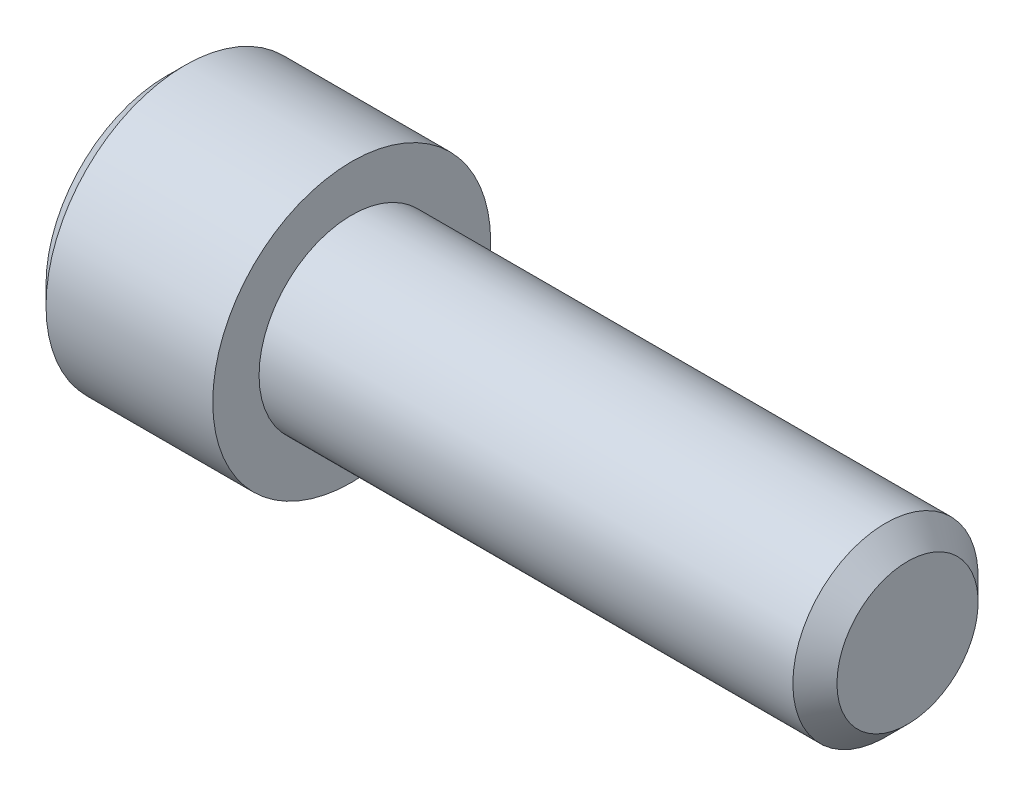
ISO-10303-21;
HEADER;
FILE_DESCRIPTION(('STEP AP214'),'2;1');
FILE_NAME('part.step','',(''),(''),'','','');
FILE_SCHEMA(('AUTOMOTIVE_DESIGN { 1 0 10303 214 1 1 1 1 }'));
ENDSEC;
DATA;
#1=APPLICATION_CONTEXT('core data for automotive mechanical design processes');
#2=APPLICATION_PROTOCOL_DEFINITION('international standard','automotive_design',2000,#1);
#3=PRODUCT_CONTEXT('',#1,'mechanical');
#4=PRODUCT('Part','Part','',(#3));
#5=PRODUCT_RELATED_PRODUCT_CATEGORY('part','',(#4));
#6=PRODUCT_DEFINITION_FORMATION('','',#4);
#7=PRODUCT_DEFINITION_CONTEXT('part definition',#1,'design');
#8=PRODUCT_DEFINITION('design','',#6,#7);
#9=PRODUCT_DEFINITION_SHAPE('','',#8);
#10=(LENGTH_UNIT() NAMED_UNIT(*) SI_UNIT(.MILLI.,.METRE.));
#11=(NAMED_UNIT(*) PLANE_ANGLE_UNIT() SI_UNIT($,.RADIAN.));
#12=(NAMED_UNIT(*) SI_UNIT($,.STERADIAN.) SOLID_ANGLE_UNIT());
#13=UNCERTAINTY_MEASURE_WITH_UNIT(LENGTH_MEASURE(1.E-05),#10,'distance_accuracy_value','');
#14=(GEOMETRIC_REPRESENTATION_CONTEXT(3) GLOBAL_UNCERTAINTY_ASSIGNED_CONTEXT((#13)) GLOBAL_UNIT_ASSIGNED_CONTEXT((#10,
#11,#12)) REPRESENTATION_CONTEXT('',''));
#15=CARTESIAN_POINT('',(0.,0.,0.));
#16=DIRECTION('',(0.,0.,1.));
#17=DIRECTION('',(1.,0.,0.));
#18=AXIS2_PLACEMENT_3D('',#15,#16,#17);
#19=CARTESIAN_POINT('',(0.,0.,0.));
#20=DIRECTION('',(-1.,0.,0.));
#21=DIRECTION('',(0.,0.,1.));
#22=AXIS2_PLACEMENT_3D('',#19,#20,#21);
#23=PLANE('',#22);
#24=CARTESIAN_POINT('',(0.,0.,0.));
#25=DIRECTION('',(-1.,0.,0.));
#26=DIRECTION('',(0.,0.,1.));
#27=AXIS2_PLACEMENT_3D('',#24,#25,#26);
#28=CIRCLE('',#27,4.1275);
#29=CARTESIAN_POINT('',(0.,0.,4.1275));
#30=VERTEX_POINT('',#29);
#31=EDGE_CURVE('E134',#30,#30,#28,.T.);
#32=ORIENTED_EDGE('',*,*,#31,.T.);
#33=EDGE_LOOP('',(#32));
#34=FACE_BOUND('',#33,.T.);
#35=DIRECTION('',(0.,-0.500000000000001,-0.866025403784438));
#36=VECTOR('',#35,1.);
#37=CARTESIAN_POINT('',(0.,2.7496306570156,0.));
#38=LINE('',#37,#36);
#39=CARTESIAN_POINT('',(0.,2.7496306570156,0.));
#40=VERTEX_POINT('',#39);
#41=CARTESIAN_POINT('',(0.,1.3748153285078,-2.38125));
#42=VERTEX_POINT('',#41);
#43=EDGE_CURVE('E125',#40,#42,#38,.T.);
#44=ORIENTED_EDGE('',*,*,#43,.F.);
#45=DIRECTION('',(0.,-0.499999999999998,0.86602540378444));
#46=VECTOR('',#45,1.);
#47=CARTESIAN_POINT('',(0.,2.7496306570156,0.));
#48=LINE('',#47,#46);
#49=CARTESIAN_POINT('',(0.,1.37481532850781,2.38125));
#50=VERTEX_POINT('',#49);
#51=EDGE_CURVE('E47',#40,#50,#48,.T.);
#52=ORIENTED_EDGE('',*,*,#51,.T.);
#53=DIRECTION('',(0.,1.,0.));
#54=VECTOR('',#53,1.);
#55=CARTESIAN_POINT('',(0.,-1.37481532850779,2.38125));
#56=LINE('',#55,#54);
#57=CARTESIAN_POINT('',(0.,-1.37481532850779,2.38125));
#58=VERTEX_POINT('',#57);
#59=EDGE_CURVE('E116',#58,#50,#56,.T.);
#60=ORIENTED_EDGE('',*,*,#59,.F.);
#61=DIRECTION('',(0.,-0.500000000000001,-0.866025403784438));
#62=VECTOR('',#61,1.);
#63=CARTESIAN_POINT('',(0.,-1.37481532850779,2.38125));
#64=LINE('',#63,#62);
#65=CARTESIAN_POINT('',(0.,-2.74963065701559,0.));
#66=VERTEX_POINT('',#65);
#67=EDGE_CURVE('E119',#58,#66,#64,.T.);
#68=ORIENTED_EDGE('',*,*,#67,.T.);
#69=DIRECTION('',(0.,0.499999999999998,-0.86602540378444));
#70=VECTOR('',#69,1.);
#71=CARTESIAN_POINT('',(0.,-2.74963065701559,0.));
#72=LINE('',#71,#70);
#73=CARTESIAN_POINT('',(0.,-1.3748153285078,-2.38125));
#74=VERTEX_POINT('',#73);
#75=EDGE_CURVE('E122',#66,#74,#72,.T.);
#76=ORIENTED_EDGE('',*,*,#75,.T.);
#77=DIRECTION('',(0.,-1.,0.));
#78=VECTOR('',#77,1.);
#79=CARTESIAN_POINT('',(0.,1.3748153285078,-2.38125));
#80=LINE('',#79,#78);
#81=EDGE_CURVE('E105',#42,#74,#80,.T.);
#82=ORIENTED_EDGE('',*,*,#81,.F.);
#83=EDGE_LOOP('',(#44,#52,#60,#68,#76,#82));
#84=FACE_BOUND('',#83,.T.);
#85=ADVANCED_FACE('F32',(#34,#84),#23,.T.);
#86=CARTESIAN_POINT('',(25.4,2.41935,0.));
#87=DIRECTION('',(1.,0.,0.));
#88=DIRECTION('',(0.,0.,-1.));
#89=AXIS2_PLACEMENT_3D('',#86,#87,#88);
#90=PLANE('',#89);
#91=CARTESIAN_POINT('',(25.4,0.,0.));
#92=DIRECTION('',(-1.,0.,0.));
#93=DIRECTION('',(0.,0.,1.));
#94=AXIS2_PLACEMENT_3D('',#91,#92,#93);
#95=CIRCLE('',#94,2.41935);
#96=CARTESIAN_POINT('',(25.4,0.,2.41935));
#97=VERTEX_POINT('',#96);
#98=EDGE_CURVE('E11',#97,#97,#95,.T.);
#99=ORIENTED_EDGE('',*,*,#98,.F.);
#100=EDGE_LOOP('',(#99));
#101=FACE_BOUND('',#100,.T.);
#102=ADVANCED_FACE('F34',(#101),#90,.T.);
#103=CARTESIAN_POINT('',(25.4,0.,0.));
#104=DIRECTION('',(-1.,0.,0.));
#105=DIRECTION('',(0.,0.,1.));
#106=AXIS2_PLACEMENT_3D('',#103,#104,#105);
#107=CONICAL_SURFACE('',#106,2.41935,0.785398163397369);
#108=CARTESIAN_POINT('',(24.64435,0.,0.));
#109=DIRECTION('',(-1.,0.,0.));
#110=DIRECTION('',(0.,0.,1.));
#111=AXIS2_PLACEMENT_3D('',#108,#109,#110);
#112=CIRCLE('',#111,3.17499999999993);
#113=CARTESIAN_POINT('',(24.64435,0.,3.17499999999993));
#114=VERTEX_POINT('',#113);
#115=EDGE_CURVE('E40',#114,#114,#112,.T.);
#116=ORIENTED_EDGE('',*,*,#115,.F.);
#117=EDGE_LOOP('',(#116));
#118=FACE_BOUND('',#117,.T.);
#119=ORIENTED_EDGE('',*,*,#98,.T.);
#120=EDGE_LOOP('',(#119));
#121=FACE_BOUND('',#120,.T.);
#122=ADVANCED_FACE('F151',(#118,#121),#107,.T.);
#123=CARTESIAN_POINT('',(-31.75,0.,0.));
#124=DIRECTION('',(-1.,0.,0.));
#125=DIRECTION('',(0.,0.,1.));
#126=AXIS2_PLACEMENT_3D('',#123,#124,#125);
#127=CYLINDRICAL_SURFACE('',#126,3.17499999999996);
#128=ORIENTED_EDGE('',*,*,#115,.T.);
#129=EDGE_LOOP('',(#128));
#130=FACE_BOUND('',#129,.T.);
#131=CARTESIAN_POINT('',(6.35,0.,0.));
#132=DIRECTION('',(-1.,0.,0.));
#133=DIRECTION('',(0.,0.,1.));
#134=AXIS2_PLACEMENT_3D('',#131,#132,#133);
#135=CIRCLE('',#134,3.175);
#136=CARTESIAN_POINT('',(6.35,0.,3.175));
#137=VERTEX_POINT('',#136);
#138=EDGE_CURVE('E143',#137,#137,#135,.T.);
#139=ORIENTED_EDGE('',*,*,#138,.F.);
#140=EDGE_LOOP('',(#139));
#141=FACE_BOUND('',#140,.T.);
#142=ADVANCED_FACE('F148',(#130,#141),#127,.T.);
#143=CARTESIAN_POINT('',(6.35,4.7625,0.));
#144=DIRECTION('',(1.,0.,0.));
#145=DIRECTION('',(0.,0.,-1.));
#146=AXIS2_PLACEMENT_3D('',#143,#144,#145);
#147=PLANE('',#146);
#148=ORIENTED_EDGE('',*,*,#138,.T.);
#149=EDGE_LOOP('',(#148));
#150=FACE_BOUND('',#149,.T.);
#151=CARTESIAN_POINT('',(6.35,0.,0.));
#152=DIRECTION('',(-1.,0.,0.));
#153=DIRECTION('',(0.,0.,1.));
#154=AXIS2_PLACEMENT_3D('',#151,#152,#153);
#155=CIRCLE('',#154,4.7625);
#156=CARTESIAN_POINT('',(6.35,0.,4.7625));
#157=VERTEX_POINT('',#156);
#158=EDGE_CURVE('E140',#157,#157,#155,.T.);
#159=ORIENTED_EDGE('',*,*,#158,.F.);
#160=EDGE_LOOP('',(#159));
#161=FACE_BOUND('',#160,.T.);
#162=ADVANCED_FACE('F176',(#150,#161),#147,.T.);
#163=CARTESIAN_POINT('',(-31.75,0.,0.));
#164=DIRECTION('',(-1.,0.,0.));
#165=DIRECTION('',(0.,0.,1.));
#166=AXIS2_PLACEMENT_3D('',#163,#164,#165);
#167=CYLINDRICAL_SURFACE('',#166,4.7625);
#168=ORIENTED_EDGE('',*,*,#158,.T.);
#169=EDGE_LOOP('',(#168));
#170=FACE_BOUND('',#169,.T.);
#171=CARTESIAN_POINT('',(0.634999999999997,0.,0.));
#172=DIRECTION('',(-1.,0.,0.));
#173=DIRECTION('',(0.,0.,1.));
#174=AXIS2_PLACEMENT_3D('',#171,#172,#173);
#175=CIRCLE('',#174,4.7625);
#176=CARTESIAN_POINT('',(0.634999999999997,0.,4.7625));
#177=VERTEX_POINT('',#176);
#178=EDGE_CURVE('E137',#177,#177,#175,.T.);
#179=ORIENTED_EDGE('',*,*,#178,.F.);
#180=EDGE_LOOP('',(#179));
#181=FACE_BOUND('',#180,.T.);
#182=ADVANCED_FACE('F172',(#170,#181),#167,.T.);
#183=CARTESIAN_POINT('',(0.,0.,0.));
#184=DIRECTION('',(1.,0.,0.));
#185=DIRECTION('',(0.,0.,-1.));
#186=AXIS2_PLACEMENT_3D('',#183,#184,#185);
#187=CONICAL_SURFACE('',#186,4.1275,0.785398163397453);
#188=ORIENTED_EDGE('',*,*,#178,.T.);
#189=EDGE_LOOP('',(#188));
#190=FACE_BOUND('',#189,.T.);
#191=ORIENTED_EDGE('',*,*,#31,.F.);
#192=EDGE_LOOP('',(#191));
#193=FACE_BOUND('',#192,.T.);
#194=ADVANCED_FACE('F169',(#190,#193),#187,.T.);
#195=CARTESIAN_POINT('',(3.048,2.7496306570156,0.));
#196=DIRECTION('',(0.,-0.86602540378444,-0.499999999999998));
#197=DIRECTION('',(0.,0.499999999999998,-0.86602540378444));
#198=AXIS2_PLACEMENT_3D('',#195,#196,#197);
#199=PLANE('',#198);
#200=ORIENTED_EDGE('',*,*,#51,.F.);
#201=DIRECTION('',(-1.,0.,0.));
#202=VECTOR('',#201,1.);
#203=CARTESIAN_POINT('',(3.048,2.7496306570156,0.));
#204=LINE('',#203,#202);
#205=CARTESIAN_POINT('',(3.048,2.7496306570156,0.));
#206=VERTEX_POINT('',#205);
#207=EDGE_CURVE('E52',#206,#40,#204,.T.);
#208=ORIENTED_EDGE('',*,*,#207,.F.);
#209=DIRECTION('',(0.,-0.499999999999998,0.86602540378444));
#210=VECTOR('',#209,1.);
#211=CARTESIAN_POINT('',(3.048,2.7496306570156,0.));
#212=LINE('',#211,#210);
#213=CARTESIAN_POINT('',(3.048,1.37481532850781,2.38125));
#214=VERTEX_POINT('',#213);
#215=EDGE_CURVE('E79',#206,#214,#212,.T.);
#216=ORIENTED_EDGE('',*,*,#215,.T.);
#217=DIRECTION('',(-1.,0.,0.));
#218=VECTOR('',#217,1.);
#219=CARTESIAN_POINT('',(3.048,1.37481532850781,2.38125));
#220=LINE('',#219,#218);
#221=EDGE_CURVE('E132',#214,#50,#220,.T.);
#222=ORIENTED_EDGE('',*,*,#221,.T.);
#223=EDGE_LOOP('',(#200,#208,#216,#222));
#224=FACE_BOUND('',#223,.T.);
#225=ADVANCED_FACE('F167',(#224),#199,.T.);
#226=CARTESIAN_POINT('',(3.048,-1.37481532850779,2.38125));
#227=DIRECTION('',(0.,0.,1.));
#228=DIRECTION('',(0.,-1.,0.));
#229=AXIS2_PLACEMENT_3D('',#226,#227,#228);
#230=PLANE('',#229);
#231=ORIENTED_EDGE('',*,*,#59,.T.);
#232=ORIENTED_EDGE('',*,*,#221,.F.);
#233=DIRECTION('',(0.,1.,0.));
#234=VECTOR('',#233,1.);
#235=CARTESIAN_POINT('',(3.048,-1.37481532850779,2.38125));
#236=LINE('',#235,#234);
#237=CARTESIAN_POINT('',(3.048,-1.37481532850779,2.38125));
#238=VERTEX_POINT('',#237);
#239=EDGE_CURVE('E285',#238,#214,#236,.T.);
#240=ORIENTED_EDGE('',*,*,#239,.F.);
#241=DIRECTION('',(-1.,0.,0.));
#242=VECTOR('',#241,1.);
#243=CARTESIAN_POINT('',(3.048,-1.37481532850779,2.38125));
#244=LINE('',#243,#242);
#245=EDGE_CURVE('E130',#238,#58,#244,.T.);
#246=ORIENTED_EDGE('',*,*,#245,.T.);
#247=EDGE_LOOP('',(#231,#232,#240,#246));
#248=FACE_BOUND('',#247,.T.);
#249=ADVANCED_FACE('F204',(#248),#230,.F.);
#250=CARTESIAN_POINT('',(3.048,-1.37481532850779,2.38125));
#251=DIRECTION('',(0.,0.866025403784438,-0.500000000000001));
#252=DIRECTION('',(0.,0.500000000000001,0.866025403784438));
#253=AXIS2_PLACEMENT_3D('',#250,#251,#252);
#254=PLANE('',#253);
#255=ORIENTED_EDGE('',*,*,#67,.F.);
#256=ORIENTED_EDGE('',*,*,#245,.F.);
#257=DIRECTION('',(0.,-0.500000000000001,-0.866025403784438));
#258=VECTOR('',#257,1.);
#259=CARTESIAN_POINT('',(3.048,-1.37481532850779,2.38125));
#260=LINE('',#259,#258);
#261=CARTESIAN_POINT('',(3.048,-2.74963065701559,0.));
#262=VERTEX_POINT('',#261);
#263=EDGE_CURVE('E100',#238,#262,#260,.T.);
#264=ORIENTED_EDGE('',*,*,#263,.T.);
#265=DIRECTION('',(-1.,0.,0.));
#266=VECTOR('',#265,1.);
#267=CARTESIAN_POINT('',(3.048,-2.74963065701559,0.));
#268=LINE('',#267,#266);
#269=EDGE_CURVE('E95',#262,#66,#268,.T.);
#270=ORIENTED_EDGE('',*,*,#269,.T.);
#271=EDGE_LOOP('',(#255,#256,#264,#270));
#272=FACE_BOUND('',#271,.T.);
#273=ADVANCED_FACE('F210',(#272),#254,.T.);
#274=CARTESIAN_POINT('',(3.048,-2.74963065701559,0.));
#275=DIRECTION('',(0.,0.86602540378444,0.499999999999998));
#276=DIRECTION('',(0.,-0.499999999999998,0.86602540378444));
#277=AXIS2_PLACEMENT_3D('',#274,#275,#276);
#278=PLANE('',#277);
#279=ORIENTED_EDGE('',*,*,#75,.F.);
#280=ORIENTED_EDGE('',*,*,#269,.F.);
#281=DIRECTION('',(0.,0.499999999999998,-0.86602540378444));
#282=VECTOR('',#281,1.);
#283=CARTESIAN_POINT('',(3.048,-2.74963065701559,0.));
#284=LINE('',#283,#282);
#285=CARTESIAN_POINT('',(3.048,-1.3748153285078,-2.38125));
#286=VERTEX_POINT('',#285);
#287=EDGE_CURVE('E90',#262,#286,#284,.T.);
#288=ORIENTED_EDGE('',*,*,#287,.T.);
#289=DIRECTION('',(-1.,0.,0.));
#290=VECTOR('',#289,1.);
#291=CARTESIAN_POINT('',(3.048,-1.3748153285078,-2.38125));
#292=LINE('',#291,#290);
#293=EDGE_CURVE('E94',#286,#74,#292,.T.);
#294=ORIENTED_EDGE('',*,*,#293,.T.);
#295=EDGE_LOOP('',(#279,#280,#288,#294));
#296=FACE_BOUND('',#295,.T.);
#297=ADVANCED_FACE('F93',(#296),#278,.T.);
#298=CARTESIAN_POINT('',(3.048,1.3748153285078,-2.38125));
#299=DIRECTION('',(0.,0.,-1.));
#300=DIRECTION('',(0.,1.,0.));
#301=AXIS2_PLACEMENT_3D('',#298,#299,#300);
#302=PLANE('',#301);
#303=ORIENTED_EDGE('',*,*,#81,.T.);
#304=ORIENTED_EDGE('',*,*,#293,.F.);
#305=DIRECTION('',(0.,-1.,0.));
#306=VECTOR('',#305,1.);
#307=CARTESIAN_POINT('',(3.048,1.3748153285078,-2.38125));
#308=LINE('',#307,#306);
#309=CARTESIAN_POINT('',(3.048,1.3748153285078,-2.38125));
#310=VERTEX_POINT('',#309);
#311=EDGE_CURVE('E99',#310,#286,#308,.T.);
#312=ORIENTED_EDGE('',*,*,#311,.F.);
#313=DIRECTION('',(-1.,0.,0.));
#314=VECTOR('',#313,1.);
#315=CARTESIAN_POINT('',(3.048,1.3748153285078,-2.38125));
#316=LINE('',#315,#314);
#317=EDGE_CURVE('E75',#310,#42,#316,.T.);
#318=ORIENTED_EDGE('',*,*,#317,.T.);
#319=EDGE_LOOP('',(#303,#304,#312,#318));
#320=FACE_BOUND('',#319,.T.);
#321=ADVANCED_FACE('F102',(#320),#302,.F.);
#322=CARTESIAN_POINT('',(3.048,2.7496306570156,0.));
#323=DIRECTION('',(0.,0.866025403784438,-0.500000000000001));
#324=DIRECTION('',(0.,0.500000000000001,0.866025403784438));
#325=AXIS2_PLACEMENT_3D('',#322,#323,#324);
#326=PLANE('',#325);
#327=ORIENTED_EDGE('',*,*,#43,.T.);
#328=ORIENTED_EDGE('',*,*,#317,.F.);
#329=DIRECTION('',(0.,-0.500000000000001,-0.866025403784438));
#330=VECTOR('',#329,1.);
#331=CARTESIAN_POINT('',(3.048,2.7496306570156,0.));
#332=LINE('',#331,#330);
#333=EDGE_CURVE('E110',#206,#310,#332,.T.);
#334=ORIENTED_EDGE('',*,*,#333,.F.);
#335=ORIENTED_EDGE('',*,*,#207,.T.);
#336=EDGE_LOOP('',(#327,#328,#334,#335));
#337=FACE_BOUND('',#336,.T.);
#338=ADVANCED_FACE('F230',(#337),#326,.F.);
#339=CARTESIAN_POINT('',(3.048,4.12444598552339,-2.38125000000001));
#340=DIRECTION('',(1.,0.,0.));
#341=DIRECTION('',(0.,0.,-1.));
#342=AXIS2_PLACEMENT_3D('',#339,#340,#341);
#343=PLANE('',#342);
#344=ORIENTED_EDGE('',*,*,#215,.F.);
#345=ORIENTED_EDGE('',*,*,#333,.T.);
#346=ORIENTED_EDGE('',*,*,#311,.T.);
#347=ORIENTED_EDGE('',*,*,#287,.F.);
#348=ORIENTED_EDGE('',*,*,#263,.F.);
#349=ORIENTED_EDGE('',*,*,#239,.T.);
#350=EDGE_LOOP('',(#344,#345,#346,#347,#348,#349));
#351=FACE_BOUND('',#350,.T.);
#352=ADVANCED_FACE('F108',(#351),#343,.F.);
#353=CLOSED_SHELL('',(#85,#102,#122,#142,#162,#182,#194,#225,#249,#273,#297,#321,#338,#352));
#354=MANIFOLD_SOLID_BREP('B2',#353);
#355=ADVANCED_BREP_SHAPE_REPRESENTATION('',(#18,#354),#14);
#356=SHAPE_DEFINITION_REPRESENTATION(#9,#355);
ENDSEC;
END-ISO-10303-21;
